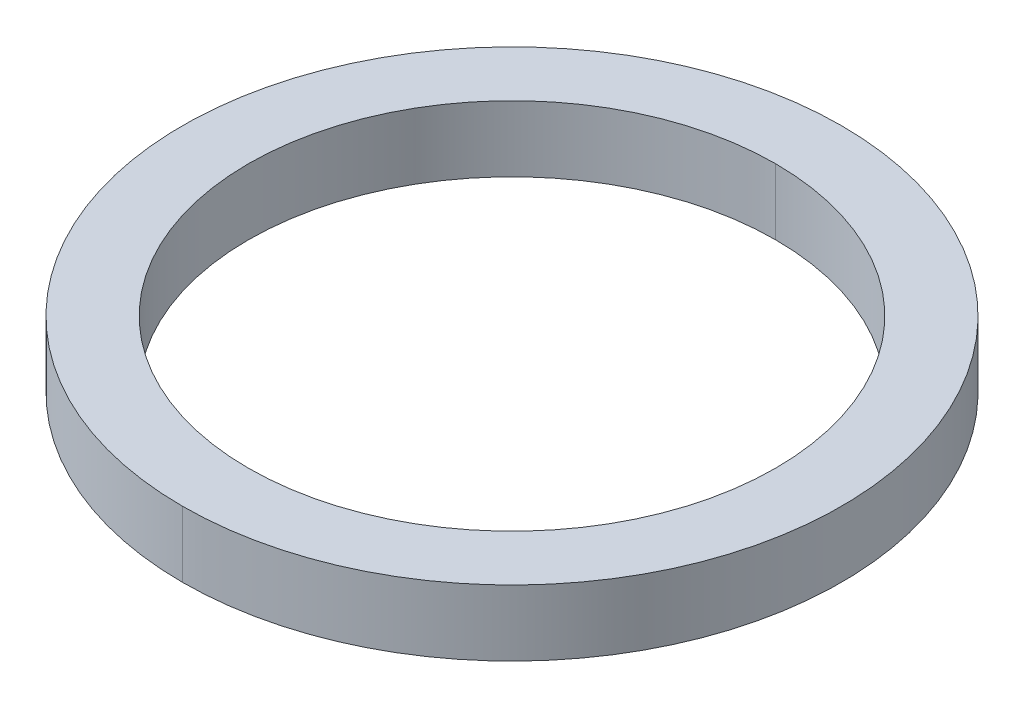
ISO-10303-21;
HEADER;
FILE_DESCRIPTION(('STEP AP214'),'2;1');
FILE_NAME('part.step','',(''),(''),'','','');
FILE_SCHEMA(('AUTOMOTIVE_DESIGN { 1 0 10303 214 1 1 1 1 }'));
ENDSEC;
DATA;
#1=APPLICATION_CONTEXT('core data for automotive mechanical design processes');
#2=APPLICATION_PROTOCOL_DEFINITION('international standard','automotive_design',2000,#1);
#3=PRODUCT_CONTEXT('',#1,'mechanical');
#4=PRODUCT('Part','Part','',(#3));
#5=PRODUCT_RELATED_PRODUCT_CATEGORY('part','',(#4));
#6=PRODUCT_DEFINITION_FORMATION('','',#4);
#7=PRODUCT_DEFINITION_CONTEXT('part definition',#1,'design');
#8=PRODUCT_DEFINITION('design','',#6,#7);
#9=PRODUCT_DEFINITION_SHAPE('','',#8);
#10=(LENGTH_UNIT() NAMED_UNIT(*) SI_UNIT(.MILLI.,.METRE.));
#11=(NAMED_UNIT(*) PLANE_ANGLE_UNIT() SI_UNIT($,.RADIAN.));
#12=(NAMED_UNIT(*) SI_UNIT($,.STERADIAN.) SOLID_ANGLE_UNIT());
#13=UNCERTAINTY_MEASURE_WITH_UNIT(LENGTH_MEASURE(1.E-05),#10,'distance_accuracy_value','');
#14=(GEOMETRIC_REPRESENTATION_CONTEXT(3) GLOBAL_UNCERTAINTY_ASSIGNED_CONTEXT((#13)) GLOBAL_UNIT_ASSIGNED_CONTEXT((#10,
#11,#12)) REPRESENTATION_CONTEXT('',''));
#15=CARTESIAN_POINT('',(0.,0.,0.));
#16=DIRECTION('',(0.,0.,1.));
#17=DIRECTION('',(1.,0.,0.));
#18=AXIS2_PLACEMENT_3D('',#15,#16,#17);
#19=CARTESIAN_POINT('',(1.5,-34.8763460722999,0.));
#20=DIRECTION('',(0.,-1.,0.));
#21=DIRECTION('',(0.,0.,-1.));
#22=AXIS2_PLACEMENT_3D('',#19,#20,#21);
#23=CYLINDRICAL_SURFACE('',#22,5.);
#24=CARTESIAN_POINT('',(1.5,-33.5,0.));
#25=DIRECTION('',(0.,-1.,0.));
#26=DIRECTION('',(0.,0.,-1.));
#27=AXIS2_PLACEMENT_3D('',#24,#25,#26);
#28=CIRCLE('',#27,5.);
#29=CARTESIAN_POINT('',(1.5,-33.5,-5.));
#30=VERTEX_POINT('',#29);
#31=CARTESIAN_POINT('',(1.5,-33.5,5.));
#32=VERTEX_POINT('',#31);
#33=EDGE_CURVE('E88',#30,#32,#28,.T.);
#34=ORIENTED_EDGE('',*,*,#33,.T.);
#35=DIRECTION('',(0.,-1.,0.));
#36=VECTOR('',#35,1.);
#37=CARTESIAN_POINT('',(1.5,-34.8763460722999,5.));
#38=LINE('',#37,#36);
#39=CARTESIAN_POINT('',(1.5,-34.5,5.));
#40=VERTEX_POINT('',#39);
#41=EDGE_CURVE('E78',#32,#40,#38,.T.);
#42=ORIENTED_EDGE('',*,*,#41,.T.);
#43=CARTESIAN_POINT('',(1.5,-34.5,0.));
#44=DIRECTION('',(0.,-1.,0.));
#45=DIRECTION('',(0.,0.,-1.));
#46=AXIS2_PLACEMENT_3D('',#43,#44,#45);
#47=CIRCLE('',#46,5.);
#48=CARTESIAN_POINT('',(1.5,-34.5,-5.));
#49=VERTEX_POINT('',#48);
#50=EDGE_CURVE('E95',#49,#40,#47,.T.);
#51=ORIENTED_EDGE('',*,*,#50,.F.);
#52=DIRECTION('',(0.,-1.,0.));
#53=VECTOR('',#52,1.);
#54=CARTESIAN_POINT('',(1.5,-34.8763460722999,-5.));
#55=LINE('',#54,#53);
#56=EDGE_CURVE('E96',#30,#49,#55,.T.);
#57=ORIENTED_EDGE('',*,*,#56,.F.);
#58=EDGE_LOOP('',(#34,#42,#51,#57));
#59=FACE_BOUND('',#58,.T.);
#60=ADVANCED_FACE('F16',(#59),#23,.T.);
#61=CARTESIAN_POINT('',(1.5,-34.8763460722999,0.));
#62=DIRECTION('',(0.,-1.,0.));
#63=DIRECTION('',(0.,0.,-1.));
#64=AXIS2_PLACEMENT_3D('',#61,#62,#63);
#65=CYLINDRICAL_SURFACE('',#64,4.);
#66=CARTESIAN_POINT('',(1.5,-33.5,0.));
#67=DIRECTION('',(0.,-1.,0.));
#68=DIRECTION('',(0.,0.,-1.));
#69=AXIS2_PLACEMENT_3D('',#66,#67,#68);
#70=CIRCLE('',#69,4.);
#71=CARTESIAN_POINT('',(1.5,-33.5,4.));
#72=VERTEX_POINT('',#71);
#73=CARTESIAN_POINT('',(1.5,-33.5,-4.));
#74=VERTEX_POINT('',#73);
#75=EDGE_CURVE('E20',#72,#74,#70,.T.);
#76=ORIENTED_EDGE('',*,*,#75,.F.);
#77=DIRECTION('',(0.,-1.,0.));
#78=VECTOR('',#77,1.);
#79=CARTESIAN_POINT('',(1.5,-34.8763460722999,4.));
#80=LINE('',#79,#78);
#81=CARTESIAN_POINT('',(1.5,-34.5,4.));
#82=VERTEX_POINT('',#81);
#83=EDGE_CURVE('E27',#72,#82,#80,.T.);
#84=ORIENTED_EDGE('',*,*,#83,.T.);
#85=CARTESIAN_POINT('',(1.5,-34.5,0.));
#86=DIRECTION('',(0.,-1.,0.));
#87=DIRECTION('',(0.,0.,-1.));
#88=AXIS2_PLACEMENT_3D('',#85,#86,#87);
#89=CIRCLE('',#88,4.);
#90=CARTESIAN_POINT('',(1.5,-34.5,-4.));
#91=VERTEX_POINT('',#90);
#92=EDGE_CURVE('E73',#82,#91,#89,.T.);
#93=ORIENTED_EDGE('',*,*,#92,.T.);
#94=DIRECTION('',(0.,-1.,0.));
#95=VECTOR('',#94,1.);
#96=CARTESIAN_POINT('',(1.5,-34.8763460722999,-4.));
#97=LINE('',#96,#95);
#98=EDGE_CURVE('E10',#74,#91,#97,.T.);
#99=ORIENTED_EDGE('',*,*,#98,.F.);
#100=EDGE_LOOP('',(#76,#84,#93,#99));
#101=FACE_BOUND('',#100,.T.);
#102=ADVANCED_FACE('F75',(#101),#65,.F.);
#103=CARTESIAN_POINT('',(1.5,-34.8763460722999,0.));
#104=DIRECTION('',(0.,-1.,0.));
#105=DIRECTION('',(0.,0.,-1.));
#106=AXIS2_PLACEMENT_3D('',#103,#104,#105);
#107=CYLINDRICAL_SURFACE('',#106,4.);
#108=ORIENTED_EDGE('',*,*,#83,.F.);
#109=CARTESIAN_POINT('',(1.5,-33.5,0.));
#110=DIRECTION('',(0.,-1.,0.));
#111=DIRECTION('',(0.,0.,-1.));
#112=AXIS2_PLACEMENT_3D('',#109,#110,#111);
#113=CIRCLE('',#112,4.);
#114=EDGE_CURVE('E69',#74,#72,#113,.T.);
#115=ORIENTED_EDGE('',*,*,#114,.F.);
#116=ORIENTED_EDGE('',*,*,#98,.T.);
#117=CARTESIAN_POINT('',(1.5,-34.5,0.));
#118=DIRECTION('',(0.,-1.,0.));
#119=DIRECTION('',(0.,0.,-1.));
#120=AXIS2_PLACEMENT_3D('',#117,#118,#119);
#121=CIRCLE('',#120,4.);
#122=EDGE_CURVE('E71',#91,#82,#121,.T.);
#123=ORIENTED_EDGE('',*,*,#122,.T.);
#124=EDGE_LOOP('',(#108,#115,#116,#123));
#125=FACE_BOUND('',#124,.T.);
#126=ADVANCED_FACE('F67',(#125),#107,.F.);
#127=CARTESIAN_POINT('',(5.5,-34.5,0.));
#128=DIRECTION('',(0.,-1.,0.));
#129=DIRECTION('',(0.,0.,-1.));
#130=AXIS2_PLACEMENT_3D('',#127,#128,#129);
#131=PLANE('',#130);
#132=ORIENTED_EDGE('',*,*,#122,.F.);
#133=ORIENTED_EDGE('',*,*,#92,.F.);
#134=EDGE_LOOP('',(#132,#133));
#135=FACE_BOUND('',#134,.T.);
#136=ORIENTED_EDGE('',*,*,#50,.T.);
#137=CARTESIAN_POINT('',(1.5,-34.5,0.));
#138=DIRECTION('',(0.,-1.,0.));
#139=DIRECTION('',(0.,0.,-1.));
#140=AXIS2_PLACEMENT_3D('',#137,#138,#139);
#141=CIRCLE('',#140,5.);
#142=EDGE_CURVE('E91',#40,#49,#141,.T.);
#143=ORIENTED_EDGE('',*,*,#142,.T.);
#144=EDGE_LOOP('',(#136,#143));
#145=FACE_BOUND('',#144,.T.);
#146=ADVANCED_FACE('F18',(#135,#145),#131,.T.);
#147=CARTESIAN_POINT('',(1.5,-34.8763460722999,0.));
#148=DIRECTION('',(0.,-1.,0.));
#149=DIRECTION('',(0.,0.,-1.));
#150=AXIS2_PLACEMENT_3D('',#147,#148,#149);
#151=CYLINDRICAL_SURFACE('',#150,5.);
#152=ORIENTED_EDGE('',*,*,#41,.F.);
#153=CARTESIAN_POINT('',(1.5,-33.5,0.));
#154=DIRECTION('',(0.,-1.,0.));
#155=DIRECTION('',(0.,0.,-1.));
#156=AXIS2_PLACEMENT_3D('',#153,#154,#155);
#157=CIRCLE('',#156,5.);
#158=EDGE_CURVE('E82',#32,#30,#157,.T.);
#159=ORIENTED_EDGE('',*,*,#158,.T.);
#160=ORIENTED_EDGE('',*,*,#56,.T.);
#161=ORIENTED_EDGE('',*,*,#142,.F.);
#162=EDGE_LOOP('',(#152,#159,#160,#161));
#163=FACE_BOUND('',#162,.T.);
#164=ADVANCED_FACE('F169',(#163),#151,.T.);
#165=CARTESIAN_POINT('',(5.5,-33.5,0.));
#166=DIRECTION('',(0.,1.,0.));
#167=DIRECTION('',(1.,0.,0.));
#168=AXIS2_PLACEMENT_3D('',#165,#166,#167);
#169=PLANE('',#168);
#170=ORIENTED_EDGE('',*,*,#114,.T.);
#171=ORIENTED_EDGE('',*,*,#75,.T.);
#172=EDGE_LOOP('',(#170,#171));
#173=FACE_BOUND('',#172,.T.);
#174=ORIENTED_EDGE('',*,*,#33,.F.);
#175=ORIENTED_EDGE('',*,*,#158,.F.);
#176=EDGE_LOOP('',(#174,#175));
#177=FACE_BOUND('',#176,.T.);
#178=ADVANCED_FACE('F79',(#173,#177),#169,.T.);
#179=CLOSED_SHELL('',(#60,#102,#126,#146,#164,#178));
#180=MANIFOLD_SOLID_BREP('B1',#179);
#181=ADVANCED_BREP_SHAPE_REPRESENTATION('',(#18,#180),#14);
#182=SHAPE_DEFINITION_REPRESENTATION(#9,#181);
ENDSEC;
END-ISO-10303-21;
